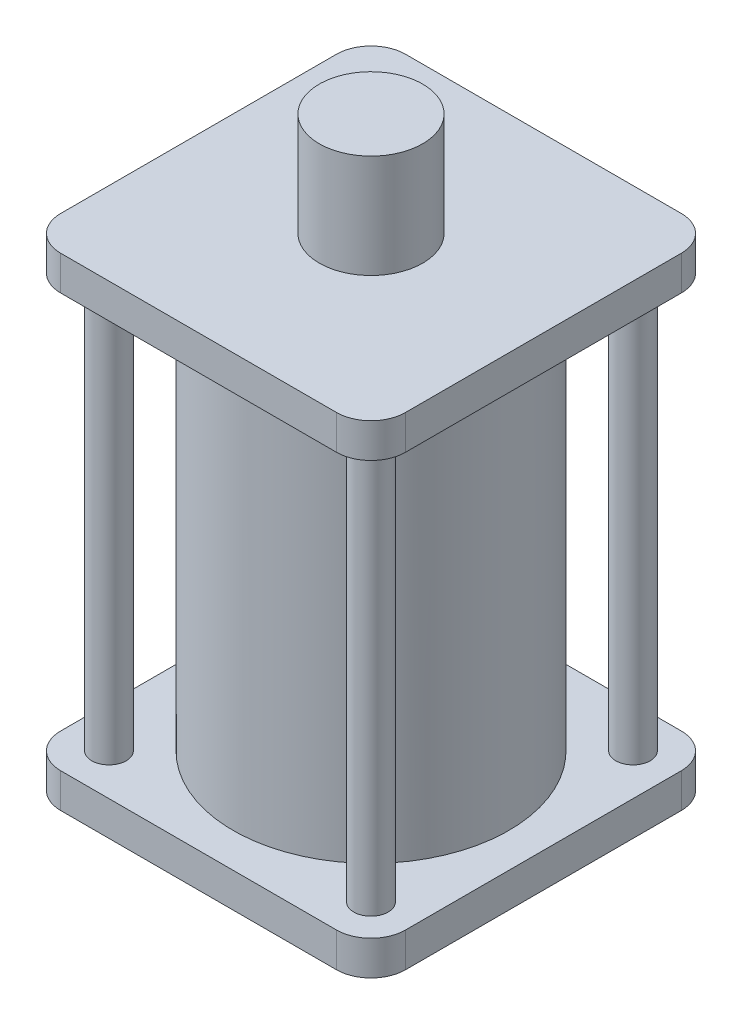
ISO-10303-21;
HEADER;
FILE_DESCRIPTION(('STEP AP214'),'2;1');
FILE_NAME('part.step','',(''),(''),'','','');
FILE_SCHEMA(('AUTOMOTIVE_DESIGN { 1 0 10303 214 1 1 1 1 }'));
ENDSEC;
DATA;
#1=APPLICATION_CONTEXT('core data for automotive mechanical design processes');
#2=APPLICATION_PROTOCOL_DEFINITION('international standard','automotive_design',2000,#1);
#3=PRODUCT_CONTEXT('',#1,'mechanical');
#4=PRODUCT('Part','Part','',(#3));
#5=PRODUCT_RELATED_PRODUCT_CATEGORY('part','',(#4));
#6=PRODUCT_DEFINITION_FORMATION('','',#4);
#7=PRODUCT_DEFINITION_CONTEXT('part definition',#1,'design');
#8=PRODUCT_DEFINITION('design','',#6,#7);
#9=PRODUCT_DEFINITION_SHAPE('','',#8);
#10=(LENGTH_UNIT() NAMED_UNIT(*) SI_UNIT(.MILLI.,.METRE.));
#11=(NAMED_UNIT(*) PLANE_ANGLE_UNIT() SI_UNIT($,.RADIAN.));
#12=(NAMED_UNIT(*) SI_UNIT($,.STERADIAN.) SOLID_ANGLE_UNIT());
#13=UNCERTAINTY_MEASURE_WITH_UNIT(LENGTH_MEASURE(1.E-05),#10,'distance_accuracy_value','');
#14=(GEOMETRIC_REPRESENTATION_CONTEXT(3) GLOBAL_UNCERTAINTY_ASSIGNED_CONTEXT((#13)) GLOBAL_UNIT_ASSIGNED_CONTEXT((#10,
#11,#12)) REPRESENTATION_CONTEXT('',''));
#15=CARTESIAN_POINT('',(0.,0.,0.));
#16=DIRECTION('',(0.,0.,1.));
#17=DIRECTION('',(1.,0.,0.));
#18=AXIS2_PLACEMENT_3D('',#15,#16,#17);
#19=CARTESIAN_POINT('',(0.,170.,0.));
#20=DIRECTION('',(0.,-1.,0.));
#21=DIRECTION('',(0.,0.,-1.));
#22=AXIS2_PLACEMENT_3D('',#19,#20,#21);
#23=CYLINDRICAL_SURFACE('',#22,15.);
#24=CARTESIAN_POINT('',(0.,170.,0.));
#25=DIRECTION('',(0.,1.,0.));
#26=DIRECTION('',(0.,0.,1.));
#27=AXIS2_PLACEMENT_3D('',#24,#25,#26);
#28=CIRCLE('',#27,15.);
#29=CARTESIAN_POINT('',(0.,170.,15.));
#30=VERTEX_POINT('',#29);
#31=EDGE_CURVE('E11',#30,#30,#28,.T.);
#32=ORIENTED_EDGE('',*,*,#31,.F.);
#33=EDGE_LOOP('',(#32));
#34=FACE_BOUND('',#33,.T.);
#35=CARTESIAN_POINT('',(0.,140.,0.));
#36=DIRECTION('',(0.,1.,0.));
#37=DIRECTION('',(0.,0.,1.));
#38=AXIS2_PLACEMENT_3D('',#35,#36,#37);
#39=CIRCLE('',#38,15.);
#40=CARTESIAN_POINT('',(0.,140.,15.));
#41=VERTEX_POINT('',#40);
#42=EDGE_CURVE('E45',#41,#41,#39,.T.);
#43=ORIENTED_EDGE('',*,*,#42,.T.);
#44=EDGE_LOOP('',(#43));
#45=FACE_BOUND('',#44,.T.);
#46=ADVANCED_FACE('F42',(#34,#45),#23,.T.);
#47=CARTESIAN_POINT('',(0.,170.,0.));
#48=DIRECTION('',(0.,1.,0.));
#49=DIRECTION('',(0.,0.,1.));
#50=AXIS2_PLACEMENT_3D('',#47,#48,#49);
#51=PLANE('',#50);
#52=ORIENTED_EDGE('',*,*,#31,.T.);
#53=EDGE_LOOP('',(#52));
#54=FACE_BOUND('',#53,.T.);
#55=ADVANCED_FACE('F57',(#54),#51,.T.);
#56=CARTESIAN_POINT('',(0.,140.,0.));
#57=DIRECTION('',(0.,1.,0.));
#58=DIRECTION('',(0.,0.,1.));
#59=AXIS2_PLACEMENT_3D('',#56,#57,#58);
#60=PLANE('',#59);
#61=ORIENTED_EDGE('',*,*,#42,.F.);
#62=EDGE_LOOP('',(#61));
#63=FACE_BOUND('',#62,.T.);
#64=ADVANCED_FACE('F55',(#63),#60,.F.);
#65=CLOSED_SHELL('',(#46,#55,#64));
#66=MANIFOLD_SOLID_BREP('B2',#65);
#67=CARTESIAN_POINT('',(50.,10.,50.));
#68=DIRECTION('',(-1.,0.,0.));
#69=DIRECTION('',(0.,0.,1.));
#70=AXIS2_PLACEMENT_3D('',#67,#68,#69);
#71=PLANE('',#70);
#72=DIRECTION('',(0.,0.,-1.));
#73=VECTOR('',#72,1.);
#74=CARTESIAN_POINT('',(50.,0.,50.));
#75=LINE('',#74,#73);
#76=CARTESIAN_POINT('',(50.,0.,40.));
#77=VERTEX_POINT('',#76);
#78=CARTESIAN_POINT('',(50.,0.,-40.));
#79=VERTEX_POINT('',#78);
#80=EDGE_CURVE('E223',#77,#79,#75,.T.);
#81=ORIENTED_EDGE('',*,*,#80,.T.);
#82=DIRECTION('',(0.,-1.,0.));
#83=VECTOR('',#82,1.);
#84=CARTESIAN_POINT('',(50.,10.,-40.));
#85=LINE('',#84,#83);
#86=CARTESIAN_POINT('',(50.,10.,-40.));
#87=VERTEX_POINT('',#86);
#88=EDGE_CURVE('E201',#79,#87,#85,.F.);
#89=ORIENTED_EDGE('',*,*,#88,.T.);
#90=DIRECTION('',(0.,0.,-1.));
#91=VECTOR('',#90,1.);
#92=CARTESIAN_POINT('',(50.,10.,50.));
#93=LINE('',#92,#91);
#94=CARTESIAN_POINT('',(50.,10.,40.));
#95=VERTEX_POINT('',#94);
#96=EDGE_CURVE('E234',#95,#87,#93,.T.);
#97=ORIENTED_EDGE('',*,*,#96,.F.);
#98=DIRECTION('',(0.,-1.,0.));
#99=VECTOR('',#98,1.);
#100=CARTESIAN_POINT('',(50.,10.,40.));
#101=LINE('',#100,#99);
#102=EDGE_CURVE('E206',#95,#77,#101,.T.);
#103=ORIENTED_EDGE('',*,*,#102,.T.);
#104=EDGE_LOOP('',(#81,#89,#97,#103));
#105=FACE_BOUND('',#104,.T.);
#106=ADVANCED_FACE('F82',(#105),#71,.F.);
#107=CARTESIAN_POINT('',(-50.,10.,-50.));
#108=DIRECTION('',(0.,0.,1.));
#109=DIRECTION('',(1.,0.,0.));
#110=AXIS2_PLACEMENT_3D('',#107,#108,#109);
#111=PLANE('',#110);
#112=DIRECTION('',(-1.,0.,0.));
#113=VECTOR('',#112,1.);
#114=CARTESIAN_POINT('',(-50.,10.,-50.));
#115=LINE('',#114,#113);
#116=CARTESIAN_POINT('',(40.,10.,-50.));
#117=VERTEX_POINT('',#116);
#118=CARTESIAN_POINT('',(-40.,10.,-50.));
#119=VERTEX_POINT('',#118);
#120=EDGE_CURVE('E216',#117,#119,#115,.T.);
#121=ORIENTED_EDGE('',*,*,#120,.F.);
#122=DIRECTION('',(0.,-1.,0.));
#123=VECTOR('',#122,1.);
#124=CARTESIAN_POINT('',(40.,10.,-50.));
#125=LINE('',#124,#123);
#126=CARTESIAN_POINT('',(40.,0.,-50.));
#127=VERTEX_POINT('',#126);
#128=EDGE_CURVE('E200',#117,#127,#125,.T.);
#129=ORIENTED_EDGE('',*,*,#128,.T.);
#130=DIRECTION('',(-1.,0.,0.));
#131=VECTOR('',#130,1.);
#132=CARTESIAN_POINT('',(-50.,0.,-50.));
#133=LINE('',#132,#131);
#134=CARTESIAN_POINT('',(-40.,0.,-50.));
#135=VERTEX_POINT('',#134);
#136=EDGE_CURVE('E213',#127,#135,#133,.T.);
#137=ORIENTED_EDGE('',*,*,#136,.T.);
#138=DIRECTION('',(0.,-1.,0.));
#139=VECTOR('',#138,1.);
#140=CARTESIAN_POINT('',(-40.,10.,-50.));
#141=LINE('',#140,#139);
#142=EDGE_CURVE('E218',#135,#119,#141,.F.);
#143=ORIENTED_EDGE('',*,*,#142,.T.);
#144=EDGE_LOOP('',(#121,#129,#137,#143));
#145=FACE_BOUND('',#144,.T.);
#146=ADVANCED_FACE('F212',(#145),#111,.F.);
#147=CARTESIAN_POINT('',(-50.,10.,50.));
#148=DIRECTION('',(1.,0.,0.));
#149=DIRECTION('',(0.,0.,-1.));
#150=AXIS2_PLACEMENT_3D('',#147,#148,#149);
#151=PLANE('',#150);
#152=DIRECTION('',(0.,0.,1.));
#153=VECTOR('',#152,1.);
#154=CARTESIAN_POINT('',(-50.,0.,50.));
#155=LINE('',#154,#153);
#156=CARTESIAN_POINT('',(-50.,0.,-40.));
#157=VERTEX_POINT('',#156);
#158=CARTESIAN_POINT('',(-50.,0.,40.));
#159=VERTEX_POINT('',#158);
#160=EDGE_CURVE('E222',#157,#159,#155,.T.);
#161=ORIENTED_EDGE('',*,*,#160,.T.);
#162=DIRECTION('',(0.,-1.,0.));
#163=VECTOR('',#162,1.);
#164=CARTESIAN_POINT('',(-50.,10.,40.));
#165=LINE('',#164,#163);
#166=CARTESIAN_POINT('',(-50.,10.,40.));
#167=VERTEX_POINT('',#166);
#168=EDGE_CURVE('E284',#159,#167,#165,.F.);
#169=ORIENTED_EDGE('',*,*,#168,.T.);
#170=DIRECTION('',(0.,0.,1.));
#171=VECTOR('',#170,1.);
#172=CARTESIAN_POINT('',(-50.,10.,50.));
#173=LINE('',#172,#171);
#174=CARTESIAN_POINT('',(-50.,10.,-40.));
#175=VERTEX_POINT('',#174);
#176=EDGE_CURVE('E351',#175,#167,#173,.T.);
#177=ORIENTED_EDGE('',*,*,#176,.F.);
#178=DIRECTION('',(0.,-1.,0.));
#179=VECTOR('',#178,1.);
#180=CARTESIAN_POINT('',(-50.,10.,-40.));
#181=LINE('',#180,#179);
#182=EDGE_CURVE('E281',#175,#157,#181,.T.);
#183=ORIENTED_EDGE('',*,*,#182,.T.);
#184=EDGE_LOOP('',(#161,#169,#177,#183));
#185=FACE_BOUND('',#184,.T.);
#186=ADVANCED_FACE('F373',(#185),#151,.F.);
#187=CARTESIAN_POINT('',(-50.,10.,50.));
#188=DIRECTION('',(0.,0.,-1.));
#189=DIRECTION('',(-1.,0.,0.));
#190=AXIS2_PLACEMENT_3D('',#187,#188,#189);
#191=PLANE('',#190);
#192=DIRECTION('',(1.,0.,0.));
#193=VECTOR('',#192,1.);
#194=CARTESIAN_POINT('',(-50.,0.,50.));
#195=LINE('',#194,#193);
#196=CARTESIAN_POINT('',(-40.,0.,50.));
#197=VERTEX_POINT('',#196);
#198=CARTESIAN_POINT('',(40.,0.,50.));
#199=VERTEX_POINT('',#198);
#200=EDGE_CURVE('E226',#197,#199,#195,.T.);
#201=ORIENTED_EDGE('',*,*,#200,.T.);
#202=DIRECTION('',(0.,-1.,0.));
#203=VECTOR('',#202,1.);
#204=CARTESIAN_POINT('',(40.,10.,50.));
#205=LINE('',#204,#203);
#206=CARTESIAN_POINT('',(40.,10.,50.));
#207=VERTEX_POINT('',#206);
#208=EDGE_CURVE('E279',#199,#207,#205,.F.);
#209=ORIENTED_EDGE('',*,*,#208,.T.);
#210=DIRECTION('',(1.,0.,0.));
#211=VECTOR('',#210,1.);
#212=CARTESIAN_POINT('',(-50.,10.,50.));
#213=LINE('',#212,#211);
#214=CARTESIAN_POINT('',(-40.,10.,50.));
#215=VERTEX_POINT('',#214);
#216=EDGE_CURVE('E239',#215,#207,#213,.T.);
#217=ORIENTED_EDGE('',*,*,#216,.F.);
#218=DIRECTION('',(0.,-1.,0.));
#219=VECTOR('',#218,1.);
#220=CARTESIAN_POINT('',(-40.,10.,50.));
#221=LINE('',#220,#219);
#222=EDGE_CURVE('E276',#215,#197,#221,.T.);
#223=ORIENTED_EDGE('',*,*,#222,.T.);
#224=EDGE_LOOP('',(#201,#209,#217,#223));
#225=FACE_BOUND('',#224,.T.);
#226=ADVANCED_FACE('F368',(#225),#191,.F.);
#227=CARTESIAN_POINT('',(0.,10.,0.));
#228=DIRECTION('',(0.,-1.,0.));
#229=DIRECTION('',(0.,0.,-1.));
#230=AXIS2_PLACEMENT_3D('',#227,#228,#229);
#231=PLANE('',#230);
#232=CARTESIAN_POINT('',(-38.,10.,38.));
#233=DIRECTION('',(0.,-1.,0.));
#234=DIRECTION('',(0.,0.,-1.));
#235=AXIS2_PLACEMENT_3D('',#232,#233,#234);
#236=CIRCLE('',#235,5.);
#237=CARTESIAN_POINT('',(-38.,10.,33.));
#238=VERTEX_POINT('',#237);
#239=EDGE_CURVE('E257',#238,#238,#236,.F.);
#240=ORIENTED_EDGE('',*,*,#239,.F.);
#241=EDGE_LOOP('',(#240));
#242=FACE_BOUND('',#241,.T.);
#243=CARTESIAN_POINT('',(38.,10.,38.));
#244=DIRECTION('',(0.,-1.,0.));
#245=DIRECTION('',(0.,0.,-1.));
#246=AXIS2_PLACEMENT_3D('',#243,#244,#245);
#247=CIRCLE('',#246,5.);
#248=CARTESIAN_POINT('',(38.,10.,33.));
#249=VERTEX_POINT('',#248);
#250=EDGE_CURVE('E251',#249,#249,#247,.F.);
#251=ORIENTED_EDGE('',*,*,#250,.F.);
#252=EDGE_LOOP('',(#251));
#253=FACE_BOUND('',#252,.T.);
#254=CARTESIAN_POINT('',(38.,10.,-38.));
#255=DIRECTION('',(0.,-1.,0.));
#256=DIRECTION('',(0.,0.,-1.));
#257=AXIS2_PLACEMENT_3D('',#254,#255,#256);
#258=CIRCLE('',#257,5.);
#259=CARTESIAN_POINT('',(38.,10.,-43.));
#260=VERTEX_POINT('',#259);
#261=EDGE_CURVE('E245',#260,#260,#258,.F.);
#262=ORIENTED_EDGE('',*,*,#261,.F.);
#263=EDGE_LOOP('',(#262));
#264=FACE_BOUND('',#263,.T.);
#265=CARTESIAN_POINT('',(0.,9.99999999999999,0.));
#266=DIRECTION('',(0.,-1.,0.));
#267=DIRECTION('',(0.,0.,-1.));
#268=AXIS2_PLACEMENT_3D('',#265,#266,#267);
#269=CIRCLE('',#268,40.);
#270=CARTESIAN_POINT('',(0.,9.99999999999999,-40.));
#271=VERTEX_POINT('',#270);
#272=EDGE_CURVE('E238',#271,#271,#269,.F.);
#273=ORIENTED_EDGE('',*,*,#272,.F.);
#274=EDGE_LOOP('',(#273));
#275=FACE_BOUND('',#274,.T.);
#276=CARTESIAN_POINT('',(-38.,10.,-38.));
#277=DIRECTION('',(0.,-1.,0.));
#278=DIRECTION('',(0.,0.,-1.));
#279=AXIS2_PLACEMENT_3D('',#276,#277,#278);
#280=CIRCLE('',#279,5.);
#281=CARTESIAN_POINT('',(-38.,10.,-43.));
#282=VERTEX_POINT('',#281);
#283=EDGE_CURVE('E235',#282,#282,#280,.F.);
#284=ORIENTED_EDGE('',*,*,#283,.F.);
#285=EDGE_LOOP('',(#284));
#286=FACE_BOUND('',#285,.T.);
#287=ORIENTED_EDGE('',*,*,#96,.T.);
#288=CARTESIAN_POINT('',(40.,10.,-40.));
#289=DIRECTION('',(0.,-1.,0.));
#290=DIRECTION('',(0.,0.,-1.));
#291=AXIS2_PLACEMENT_3D('',#288,#289,#290);
#292=CIRCLE('',#291,10.);
#293=EDGE_CURVE('E274',#87,#117,#292,.F.);
#294=ORIENTED_EDGE('',*,*,#293,.T.);
#295=ORIENTED_EDGE('',*,*,#120,.T.);
#296=CARTESIAN_POINT('',(-40.,10.,-40.));
#297=DIRECTION('',(0.,-1.,0.));
#298=DIRECTION('',(0.,0.,-1.));
#299=AXIS2_PLACEMENT_3D('',#296,#297,#298);
#300=CIRCLE('',#299,10.);
#301=EDGE_CURVE('E268',#119,#175,#300,.F.);
#302=ORIENTED_EDGE('',*,*,#301,.T.);
#303=ORIENTED_EDGE('',*,*,#176,.T.);
#304=CARTESIAN_POINT('',(-40.,10.,40.));
#305=DIRECTION('',(0.,-1.,0.));
#306=DIRECTION('',(0.,0.,-1.));
#307=AXIS2_PLACEMENT_3D('',#304,#305,#306);
#308=CIRCLE('',#307,10.);
#309=EDGE_CURVE('E270',#167,#215,#308,.F.);
#310=ORIENTED_EDGE('',*,*,#309,.T.);
#311=ORIENTED_EDGE('',*,*,#216,.T.);
#312=CARTESIAN_POINT('',(40.,10.,40.));
#313=DIRECTION('',(0.,-1.,0.));
#314=DIRECTION('',(0.,0.,-1.));
#315=AXIS2_PLACEMENT_3D('',#312,#313,#314);
#316=CIRCLE('',#315,10.);
#317=EDGE_CURVE('E272',#207,#95,#316,.F.);
#318=ORIENTED_EDGE('',*,*,#317,.T.);
#319=EDGE_LOOP('',(#287,#294,#295,#302,#303,#310,#311,#318));
#320=FACE_BOUND('',#319,.T.);
#321=ADVANCED_FACE('F357',(#242,#253,#264,#275,#286,#320),#231,.F.);
#322=CARTESIAN_POINT('',(0.,0.,0.));
#323=DIRECTION('',(0.,-1.,0.));
#324=DIRECTION('',(0.,0.,-1.));
#325=AXIS2_PLACEMENT_3D('',#322,#323,#324);
#326=PLANE('',#325);
#327=ORIENTED_EDGE('',*,*,#136,.F.);
#328=CARTESIAN_POINT('',(40.,0.,-40.));
#329=DIRECTION('',(0.,-1.,0.));
#330=DIRECTION('',(0.,0.,-1.));
#331=AXIS2_PLACEMENT_3D('',#328,#329,#330);
#332=CIRCLE('',#331,10.);
#333=EDGE_CURVE('E196',#127,#79,#332,.T.);
#334=ORIENTED_EDGE('',*,*,#333,.T.);
#335=ORIENTED_EDGE('',*,*,#80,.F.);
#336=CARTESIAN_POINT('',(40.,0.,40.));
#337=DIRECTION('',(0.,-1.,0.));
#338=DIRECTION('',(0.,0.,-1.));
#339=AXIS2_PLACEMENT_3D('',#336,#337,#338);
#340=CIRCLE('',#339,10.);
#341=EDGE_CURVE('E207',#77,#199,#340,.T.);
#342=ORIENTED_EDGE('',*,*,#341,.T.);
#343=ORIENTED_EDGE('',*,*,#200,.F.);
#344=CARTESIAN_POINT('',(-40.,0.,40.));
#345=DIRECTION('',(0.,-1.,0.));
#346=DIRECTION('',(0.,0.,-1.));
#347=AXIS2_PLACEMENT_3D('',#344,#345,#346);
#348=CIRCLE('',#347,10.);
#349=EDGE_CURVE('E262',#197,#159,#348,.T.);
#350=ORIENTED_EDGE('',*,*,#349,.T.);
#351=ORIENTED_EDGE('',*,*,#160,.F.);
#352=CARTESIAN_POINT('',(-40.,0.,-40.));
#353=DIRECTION('',(0.,-1.,0.));
#354=DIRECTION('',(0.,0.,-1.));
#355=AXIS2_PLACEMENT_3D('',#352,#353,#354);
#356=CIRCLE('',#355,10.);
#357=EDGE_CURVE('E217',#157,#135,#356,.T.);
#358=ORIENTED_EDGE('',*,*,#357,.T.);
#359=EDGE_LOOP('',(#327,#334,#335,#342,#343,#350,#351,#358));
#360=FACE_BOUND('',#359,.T.);
#361=ADVANCED_FACE('F220',(#360),#326,.T.);
#362=CARTESIAN_POINT('',(-38.,144.142135623731,-38.));
#363=DIRECTION('',(0.,-1.,0.));
#364=DIRECTION('',(0.,0.,-1.));
#365=AXIS2_PLACEMENT_3D('',#362,#363,#364);
#366=CYLINDRICAL_SURFACE('',#365,5.);
#367=ORIENTED_EDGE('',*,*,#283,.T.);
#368=EDGE_LOOP('',(#367));
#369=FACE_BOUND('',#368,.T.);
#370=CARTESIAN_POINT('',(-38.,130.,-38.));
#371=DIRECTION('',(0.,1.,0.));
#372=DIRECTION('',(0.,0.,1.));
#373=AXIS2_PLACEMENT_3D('',#370,#371,#372);
#374=CIRCLE('',#373,5.);
#375=CARTESIAN_POINT('',(-38.,130.,-33.));
#376=VERTEX_POINT('',#375);
#377=EDGE_CURVE('E228',#376,#376,#374,.T.);
#378=ORIENTED_EDGE('',*,*,#377,.F.);
#379=EDGE_LOOP('',(#378));
#380=FACE_BOUND('',#379,.T.);
#381=ADVANCED_FACE('F487',(#369,#380),#366,.T.);
#382=CARTESIAN_POINT('',(0.,130.,0.));
#383=DIRECTION('',(0.,-1.,0.));
#384=DIRECTION('',(0.,0.,-1.));
#385=AXIS2_PLACEMENT_3D('',#382,#383,#384);
#386=CYLINDRICAL_SURFACE('',#385,40.);
#387=CARTESIAN_POINT('',(0.,130.,0.));
#388=DIRECTION('',(0.,1.,0.));
#389=DIRECTION('',(0.,0.,1.));
#390=AXIS2_PLACEMENT_3D('',#387,#388,#389);
#391=CIRCLE('',#390,40.);
#392=CARTESIAN_POINT('',(0.,130.,40.));
#393=VERTEX_POINT('',#392);
#394=EDGE_CURVE('E342',#393,#393,#391,.T.);
#395=ORIENTED_EDGE('',*,*,#394,.F.);
#396=EDGE_LOOP('',(#395));
#397=FACE_BOUND('',#396,.T.);
#398=ORIENTED_EDGE('',*,*,#272,.T.);
#399=EDGE_LOOP('',(#398));
#400=FACE_BOUND('',#399,.T.);
#401=ADVANCED_FACE('F484',(#397,#400),#386,.T.);
#402=CARTESIAN_POINT('',(-50.,140.,-50.));
#403=DIRECTION('',(1.,0.,0.));
#404=DIRECTION('',(0.,0.,-1.));
#405=AXIS2_PLACEMENT_3D('',#402,#403,#404);
#406=PLANE('',#405);
#407=DIRECTION('',(0.,0.,1.));
#408=VECTOR('',#407,1.);
#409=CARTESIAN_POINT('',(-50.,140.,-50.));
#410=LINE('',#409,#408);
#411=CARTESIAN_POINT('',(-50.,140.,-40.));
#412=VERTEX_POINT('',#411);
#413=CARTESIAN_POINT('',(-50.,140.,40.));
#414=VERTEX_POINT('',#413);
#415=EDGE_CURVE('E341',#412,#414,#410,.T.);
#416=ORIENTED_EDGE('',*,*,#415,.F.);
#417=DIRECTION('',(0.,-1.,0.));
#418=VECTOR('',#417,1.);
#419=CARTESIAN_POINT('',(-50.,140.,-40.));
#420=LINE('',#419,#418);
#421=CARTESIAN_POINT('',(-50.,130.,-40.));
#422=VERTEX_POINT('',#421);
#423=EDGE_CURVE('E288',#412,#422,#420,.T.);
#424=ORIENTED_EDGE('',*,*,#423,.T.);
#425=DIRECTION('',(0.,0.,1.));
#426=VECTOR('',#425,1.);
#427=CARTESIAN_POINT('',(-50.,130.,-50.));
#428=LINE('',#427,#426);
#429=CARTESIAN_POINT('',(-50.,130.,40.));
#430=VERTEX_POINT('',#429);
#431=EDGE_CURVE('E332',#422,#430,#428,.T.);
#432=ORIENTED_EDGE('',*,*,#431,.T.);
#433=DIRECTION('',(0.,-1.,0.));
#434=VECTOR('',#433,1.);
#435=CARTESIAN_POINT('',(-50.,140.,40.));
#436=LINE('',#435,#434);
#437=EDGE_CURVE('E286',#430,#414,#436,.F.);
#438=ORIENTED_EDGE('',*,*,#437,.T.);
#439=EDGE_LOOP('',(#416,#424,#432,#438));
#440=FACE_BOUND('',#439,.T.);
#441=ADVANCED_FACE('F467',(#440),#406,.F.);
#442=CARTESIAN_POINT('',(-50.,140.,50.));
#443=DIRECTION('',(0.,0.,-1.));
#444=DIRECTION('',(-1.,0.,0.));
#445=AXIS2_PLACEMENT_3D('',#442,#443,#444);
#446=PLANE('',#445);
#447=DIRECTION('',(1.,0.,0.));
#448=VECTOR('',#447,1.);
#449=CARTESIAN_POINT('',(-50.,130.,50.));
#450=LINE('',#449,#448);
#451=CARTESIAN_POINT('',(-40.,130.,50.));
#452=VERTEX_POINT('',#451);
#453=CARTESIAN_POINT('',(40.,130.,50.));
#454=VERTEX_POINT('',#453);
#455=EDGE_CURVE('E321',#452,#454,#450,.T.);
#456=ORIENTED_EDGE('',*,*,#455,.T.);
#457=DIRECTION('',(0.,-1.,0.));
#458=VECTOR('',#457,1.);
#459=CARTESIAN_POINT('',(40.,140.,50.));
#460=LINE('',#459,#458);
#461=CARTESIAN_POINT('',(40.,140.,50.));
#462=VERTEX_POINT('',#461);
#463=EDGE_CURVE('E40',#454,#462,#460,.F.);
#464=ORIENTED_EDGE('',*,*,#463,.T.);
#465=DIRECTION('',(1.,0.,0.));
#466=VECTOR('',#465,1.);
#467=CARTESIAN_POINT('',(-50.,140.,50.));
#468=LINE('',#467,#466);
#469=CARTESIAN_POINT('',(-40.,140.,50.));
#470=VERTEX_POINT('',#469);
#471=EDGE_CURVE('E323',#470,#462,#468,.T.);
#472=ORIENTED_EDGE('',*,*,#471,.F.);
#473=DIRECTION('',(0.,-1.,0.));
#474=VECTOR('',#473,1.);
#475=CARTESIAN_POINT('',(-40.,140.,50.));
#476=LINE('',#475,#474);
#477=EDGE_CURVE('E90',#470,#452,#476,.T.);
#478=ORIENTED_EDGE('',*,*,#477,.T.);
#479=EDGE_LOOP('',(#456,#464,#472,#478));
#480=FACE_BOUND('',#479,.T.);
#481=ADVANCED_FACE('F320',(#480),#446,.F.);
#482=CARTESIAN_POINT('',(50.,140.,-50.));
#483=DIRECTION('',(-1.,0.,0.));
#484=DIRECTION('',(0.,0.,1.));
#485=AXIS2_PLACEMENT_3D('',#482,#483,#484);
#486=PLANE('',#485);
#487=DIRECTION('',(0.,0.,-1.));
#488=VECTOR('',#487,1.);
#489=CARTESIAN_POINT('',(50.,130.,-50.));
#490=LINE('',#489,#488);
#491=CARTESIAN_POINT('',(50.,130.,40.));
#492=VERTEX_POINT('',#491);
#493=CARTESIAN_POINT('',(50.,130.,-40.));
#494=VERTEX_POINT('',#493);
#495=EDGE_CURVE('E331',#492,#494,#490,.T.);
#496=ORIENTED_EDGE('',*,*,#495,.T.);
#497=DIRECTION('',(0.,-1.,0.));
#498=VECTOR('',#497,1.);
#499=CARTESIAN_POINT('',(50.,140.,-40.));
#500=LINE('',#499,#498);
#501=CARTESIAN_POINT('',(50.,140.,-40.));
#502=VERTEX_POINT('',#501);
#503=EDGE_CURVE('E97',#494,#502,#500,.F.);
#504=ORIENTED_EDGE('',*,*,#503,.T.);
#505=DIRECTION('',(0.,0.,-1.));
#506=VECTOR('',#505,1.);
#507=CARTESIAN_POINT('',(50.,140.,-50.));
#508=LINE('',#507,#506);
#509=CARTESIAN_POINT('',(50.,140.,40.));
#510=VERTEX_POINT('',#509);
#511=EDGE_CURVE('E459',#510,#502,#508,.T.);
#512=ORIENTED_EDGE('',*,*,#511,.F.);
#513=DIRECTION('',(0.,-1.,0.));
#514=VECTOR('',#513,1.);
#515=CARTESIAN_POINT('',(50.,140.,40.));
#516=LINE('',#515,#514);
#517=EDGE_CURVE('E311',#510,#492,#516,.T.);
#518=ORIENTED_EDGE('',*,*,#517,.T.);
#519=EDGE_LOOP('',(#496,#504,#512,#518));
#520=FACE_BOUND('',#519,.T.);
#521=ADVANCED_FACE('F470',(#520),#486,.F.);
#522=CARTESIAN_POINT('',(-50.,140.,-50.));
#523=DIRECTION('',(0.,0.,1.));
#524=DIRECTION('',(1.,0.,0.));
#525=AXIS2_PLACEMENT_3D('',#522,#523,#524);
#526=PLANE('',#525);
#527=DIRECTION('',(-1.,0.,0.));
#528=VECTOR('',#527,1.);
#529=CARTESIAN_POINT('',(-50.,130.,-50.));
#530=LINE('',#529,#528);
#531=CARTESIAN_POINT('',(40.,130.,-50.));
#532=VERTEX_POINT('',#531);
#533=CARTESIAN_POINT('',(-40.,130.,-50.));
#534=VERTEX_POINT('',#533);
#535=EDGE_CURVE('E334',#532,#534,#530,.T.);
#536=ORIENTED_EDGE('',*,*,#535,.T.);
#537=DIRECTION('',(0.,-1.,0.));
#538=VECTOR('',#537,1.);
#539=CARTESIAN_POINT('',(-40.,140.,-50.));
#540=LINE('',#539,#538);
#541=CARTESIAN_POINT('',(-40.,140.,-50.));
#542=VERTEX_POINT('',#541);
#543=EDGE_CURVE('E302',#534,#542,#540,.F.);
#544=ORIENTED_EDGE('',*,*,#543,.T.);
#545=DIRECTION('',(-1.,0.,0.));
#546=VECTOR('',#545,1.);
#547=CARTESIAN_POINT('',(-50.,140.,-50.));
#548=LINE('',#547,#546);
#549=CARTESIAN_POINT('',(40.,140.,-50.));
#550=VERTEX_POINT('',#549);
#551=EDGE_CURVE('E345',#550,#542,#548,.T.);
#552=ORIENTED_EDGE('',*,*,#551,.F.);
#553=DIRECTION('',(0.,-1.,0.));
#554=VECTOR('',#553,1.);
#555=CARTESIAN_POINT('',(40.,140.,-50.));
#556=LINE('',#555,#554);
#557=EDGE_CURVE('E299',#550,#532,#556,.T.);
#558=ORIENTED_EDGE('',*,*,#557,.T.);
#559=EDGE_LOOP('',(#536,#544,#552,#558));
#560=FACE_BOUND('',#559,.T.);
#561=ADVANCED_FACE('F469',(#560),#526,.F.);
#562=CARTESIAN_POINT('',(0.,140.,0.));
#563=DIRECTION('',(0.,1.,0.));
#564=DIRECTION('',(0.,0.,1.));
#565=AXIS2_PLACEMENT_3D('',#562,#563,#564);
#566=PLANE('',#565);
#567=ORIENTED_EDGE('',*,*,#551,.T.);
#568=CARTESIAN_POINT('',(-40.,140.,-40.));
#569=DIRECTION('',(0.,1.,0.));
#570=DIRECTION('',(0.,0.,1.));
#571=AXIS2_PLACEMENT_3D('',#568,#569,#570);
#572=CIRCLE('',#571,10.);
#573=EDGE_CURVE('E309',#542,#412,#572,.T.);
#574=ORIENTED_EDGE('',*,*,#573,.T.);
#575=ORIENTED_EDGE('',*,*,#415,.T.);
#576=CARTESIAN_POINT('',(-40.,140.,40.));
#577=DIRECTION('',(0.,1.,0.));
#578=DIRECTION('',(0.,0.,1.));
#579=AXIS2_PLACEMENT_3D('',#576,#577,#578);
#580=CIRCLE('',#579,10.);
#581=EDGE_CURVE('E304',#414,#470,#580,.T.);
#582=ORIENTED_EDGE('',*,*,#581,.T.);
#583=ORIENTED_EDGE('',*,*,#471,.T.);
#584=CARTESIAN_POINT('',(40.,140.,40.));
#585=DIRECTION('',(0.,1.,0.));
#586=DIRECTION('',(0.,0.,1.));
#587=AXIS2_PLACEMENT_3D('',#584,#585,#586);
#588=CIRCLE('',#587,10.);
#589=EDGE_CURVE('E104',#462,#510,#588,.T.);
#590=ORIENTED_EDGE('',*,*,#589,.T.);
#591=ORIENTED_EDGE('',*,*,#511,.T.);
#592=CARTESIAN_POINT('',(40.,140.,-40.));
#593=DIRECTION('',(0.,1.,0.));
#594=DIRECTION('',(0.,0.,1.));
#595=AXIS2_PLACEMENT_3D('',#592,#593,#594);
#596=CIRCLE('',#595,10.);
#597=EDGE_CURVE('E307',#502,#550,#596,.T.);
#598=ORIENTED_EDGE('',*,*,#597,.T.);
#599=EDGE_LOOP('',(#567,#574,#575,#582,#583,#590,#591,#598));
#600=FACE_BOUND('',#599,.T.);
#601=ADVANCED_FACE('F453',(#600),#566,.T.);
#602=CARTESIAN_POINT('',(0.,130.,0.));
#603=DIRECTION('',(0.,1.,0.));
#604=DIRECTION('',(0.,0.,1.));
#605=AXIS2_PLACEMENT_3D('',#602,#603,#604);
#606=PLANE('',#605);
#607=CARTESIAN_POINT('',(-38.,130.,38.));
#608=DIRECTION('',(0.,1.,0.));
#609=DIRECTION('',(0.,0.,1.));
#610=AXIS2_PLACEMENT_3D('',#607,#608,#609);
#611=CIRCLE('',#610,5.);
#612=CARTESIAN_POINT('',(-38.,130.,43.));
#613=VERTEX_POINT('',#612);
#614=EDGE_CURVE('E254',#613,#613,#611,.F.);
#615=ORIENTED_EDGE('',*,*,#614,.F.);
#616=EDGE_LOOP('',(#615));
#617=FACE_BOUND('',#616,.T.);
#618=CARTESIAN_POINT('',(38.,130.,38.));
#619=DIRECTION('',(0.,1.,0.));
#620=DIRECTION('',(0.,0.,1.));
#621=AXIS2_PLACEMENT_3D('',#618,#619,#620);
#622=CIRCLE('',#621,5.);
#623=CARTESIAN_POINT('',(38.,130.,43.));
#624=VERTEX_POINT('',#623);
#625=EDGE_CURVE('E248',#624,#624,#622,.F.);
#626=ORIENTED_EDGE('',*,*,#625,.F.);
#627=EDGE_LOOP('',(#626));
#628=FACE_BOUND('',#627,.T.);
#629=CARTESIAN_POINT('',(38.,130.,-38.));
#630=DIRECTION('',(0.,1.,0.));
#631=DIRECTION('',(0.,0.,1.));
#632=AXIS2_PLACEMENT_3D('',#629,#630,#631);
#633=CIRCLE('',#632,5.);
#634=CARTESIAN_POINT('',(38.,130.,-33.));
#635=VERTEX_POINT('',#634);
#636=EDGE_CURVE('E242',#635,#635,#633,.F.);
#637=ORIENTED_EDGE('',*,*,#636,.F.);
#638=EDGE_LOOP('',(#637));
#639=FACE_BOUND('',#638,.T.);
#640=ORIENTED_EDGE('',*,*,#377,.T.);
#641=EDGE_LOOP('',(#640));
#642=FACE_BOUND('',#641,.T.);
#643=ORIENTED_EDGE('',*,*,#394,.T.);
#644=EDGE_LOOP('',(#643));
#645=FACE_BOUND('',#644,.T.);
#646=ORIENTED_EDGE('',*,*,#431,.F.);
#647=CARTESIAN_POINT('',(-40.,130.,-40.));
#648=DIRECTION('',(0.,1.,0.));
#649=DIRECTION('',(0.,0.,1.));
#650=AXIS2_PLACEMENT_3D('',#647,#648,#649);
#651=CIRCLE('',#650,10.);
#652=EDGE_CURVE('E297',#422,#534,#651,.F.);
#653=ORIENTED_EDGE('',*,*,#652,.T.);
#654=ORIENTED_EDGE('',*,*,#535,.F.);
#655=CARTESIAN_POINT('',(40.,130.,-40.));
#656=DIRECTION('',(0.,1.,0.));
#657=DIRECTION('',(0.,0.,1.));
#658=AXIS2_PLACEMENT_3D('',#655,#656,#657);
#659=CIRCLE('',#658,10.);
#660=EDGE_CURVE('E295',#532,#494,#659,.F.);
#661=ORIENTED_EDGE('',*,*,#660,.T.);
#662=ORIENTED_EDGE('',*,*,#495,.F.);
#663=CARTESIAN_POINT('',(40.,130.,40.));
#664=DIRECTION('',(0.,1.,0.));
#665=DIRECTION('',(0.,0.,1.));
#666=AXIS2_PLACEMENT_3D('',#663,#664,#665);
#667=CIRCLE('',#666,10.);
#668=EDGE_CURVE('E293',#492,#454,#667,.F.);
#669=ORIENTED_EDGE('',*,*,#668,.T.);
#670=ORIENTED_EDGE('',*,*,#455,.F.);
#671=CARTESIAN_POINT('',(-40.,130.,40.));
#672=DIRECTION('',(0.,1.,0.));
#673=DIRECTION('',(0.,0.,1.));
#674=AXIS2_PLACEMENT_3D('',#671,#672,#673);
#675=CIRCLE('',#674,10.);
#676=EDGE_CURVE('E291',#452,#430,#675,.F.);
#677=ORIENTED_EDGE('',*,*,#676,.T.);
#678=EDGE_LOOP('',(#646,#653,#654,#661,#662,#669,#670,#677));
#679=FACE_BOUND('',#678,.T.);
#680=ADVANCED_FACE('F328',(#617,#628,#639,#642,#645,#679),#606,.F.);
#681=CARTESIAN_POINT('',(38.,144.142135623731,-38.));
#682=DIRECTION('',(0.,-1.,0.));
#683=DIRECTION('',(0.,0.,-1.));
#684=AXIS2_PLACEMENT_3D('',#681,#682,#683);
#685=CYLINDRICAL_SURFACE('',#684,5.);
#686=ORIENTED_EDGE('',*,*,#261,.T.);
#687=EDGE_LOOP('',(#686));
#688=FACE_BOUND('',#687,.T.);
#689=ORIENTED_EDGE('',*,*,#636,.T.);
#690=EDGE_LOOP('',(#689));
#691=FACE_BOUND('',#690,.T.);
#692=ADVANCED_FACE('F558',(#688,#691),#685,.T.);
#693=CARTESIAN_POINT('',(38.,144.142135623731,38.));
#694=DIRECTION('',(0.,-1.,0.));
#695=DIRECTION('',(0.,0.,-1.));
#696=AXIS2_PLACEMENT_3D('',#693,#694,#695);
#697=CYLINDRICAL_SURFACE('',#696,5.);
#698=ORIENTED_EDGE('',*,*,#250,.T.);
#699=EDGE_LOOP('',(#698));
#700=FACE_BOUND('',#699,.T.);
#701=ORIENTED_EDGE('',*,*,#625,.T.);
#702=EDGE_LOOP('',(#701));
#703=FACE_BOUND('',#702,.T.);
#704=ADVANCED_FACE('F575',(#700,#703),#697,.T.);
#705=CARTESIAN_POINT('',(-38.,144.142135623731,38.));
#706=DIRECTION('',(0.,-1.,0.));
#707=DIRECTION('',(0.,0.,-1.));
#708=AXIS2_PLACEMENT_3D('',#705,#706,#707);
#709=CYLINDRICAL_SURFACE('',#708,5.);
#710=ORIENTED_EDGE('',*,*,#239,.T.);
#711=EDGE_LOOP('',(#710));
#712=FACE_BOUND('',#711,.T.);
#713=ORIENTED_EDGE('',*,*,#614,.T.);
#714=EDGE_LOOP('',(#713));
#715=FACE_BOUND('',#714,.T.);
#716=ADVANCED_FACE('F400',(#712,#715),#709,.T.);
#717=CARTESIAN_POINT('',(40.,10.,-40.));
#718=DIRECTION('',(0.,-1.,0.));
#719=DIRECTION('',(0.,0.,-1.));
#720=AXIS2_PLACEMENT_3D('',#717,#718,#719);
#721=CYLINDRICAL_SURFACE('',#720,10.);
#722=ORIENTED_EDGE('',*,*,#293,.F.);
#723=ORIENTED_EDGE('',*,*,#88,.F.);
#724=ORIENTED_EDGE('',*,*,#333,.F.);
#725=ORIENTED_EDGE('',*,*,#128,.F.);
#726=EDGE_LOOP('',(#722,#723,#724,#725));
#727=FACE_BOUND('',#726,.T.);
#728=ADVANCED_FACE('F199',(#727),#721,.T.);
#729=CARTESIAN_POINT('',(40.,10.,40.));
#730=DIRECTION('',(0.,-1.,0.));
#731=DIRECTION('',(0.,0.,-1.));
#732=AXIS2_PLACEMENT_3D('',#729,#730,#731);
#733=CYLINDRICAL_SURFACE('',#732,10.);
#734=ORIENTED_EDGE('',*,*,#317,.F.);
#735=ORIENTED_EDGE('',*,*,#208,.F.);
#736=ORIENTED_EDGE('',*,*,#341,.F.);
#737=ORIENTED_EDGE('',*,*,#102,.F.);
#738=EDGE_LOOP('',(#734,#735,#736,#737));
#739=FACE_BOUND('',#738,.T.);
#740=ADVANCED_FACE('F365',(#739),#733,.T.);
#741=CARTESIAN_POINT('',(-40.,10.,40.));
#742=DIRECTION('',(0.,-1.,0.));
#743=DIRECTION('',(0.,0.,-1.));
#744=AXIS2_PLACEMENT_3D('',#741,#742,#743);
#745=CYLINDRICAL_SURFACE('',#744,10.);
#746=ORIENTED_EDGE('',*,*,#309,.F.);
#747=ORIENTED_EDGE('',*,*,#168,.F.);
#748=ORIENTED_EDGE('',*,*,#349,.F.);
#749=ORIENTED_EDGE('',*,*,#222,.F.);
#750=EDGE_LOOP('',(#746,#747,#748,#749));
#751=FACE_BOUND('',#750,.T.);
#752=ADVANCED_FACE('F370',(#751),#745,.T.);
#753=CARTESIAN_POINT('',(-40.,10.,-40.));
#754=DIRECTION('',(0.,-1.,0.));
#755=DIRECTION('',(0.,0.,-1.));
#756=AXIS2_PLACEMENT_3D('',#753,#754,#755);
#757=CYLINDRICAL_SURFACE('',#756,10.);
#758=ORIENTED_EDGE('',*,*,#301,.F.);
#759=ORIENTED_EDGE('',*,*,#142,.F.);
#760=ORIENTED_EDGE('',*,*,#357,.F.);
#761=ORIENTED_EDGE('',*,*,#182,.F.);
#762=EDGE_LOOP('',(#758,#759,#760,#761));
#763=FACE_BOUND('',#762,.T.);
#764=ADVANCED_FACE('F378',(#763),#757,.T.);
#765=CARTESIAN_POINT('',(-40.,140.,-40.));
#766=DIRECTION('',(0.,-1.,0.));
#767=DIRECTION('',(0.,0.,-1.));
#768=AXIS2_PLACEMENT_3D('',#765,#766,#767);
#769=CYLINDRICAL_SURFACE('',#768,10.);
#770=ORIENTED_EDGE('',*,*,#573,.F.);
#771=ORIENTED_EDGE('',*,*,#543,.F.);
#772=ORIENTED_EDGE('',*,*,#652,.F.);
#773=ORIENTED_EDGE('',*,*,#423,.F.);
#774=EDGE_LOOP('',(#770,#771,#772,#773));
#775=FACE_BOUND('',#774,.T.);
#776=ADVANCED_FACE('F380',(#775),#769,.T.);
#777=CARTESIAN_POINT('',(40.,140.,-40.));
#778=DIRECTION('',(0.,-1.,0.));
#779=DIRECTION('',(0.,0.,-1.));
#780=AXIS2_PLACEMENT_3D('',#777,#778,#779);
#781=CYLINDRICAL_SURFACE('',#780,10.);
#782=ORIENTED_EDGE('',*,*,#597,.F.);
#783=ORIENTED_EDGE('',*,*,#503,.F.);
#784=ORIENTED_EDGE('',*,*,#660,.F.);
#785=ORIENTED_EDGE('',*,*,#557,.F.);
#786=EDGE_LOOP('',(#782,#783,#784,#785));
#787=FACE_BOUND('',#786,.T.);
#788=ADVANCED_FACE('F386',(#787),#781,.T.);
#789=CARTESIAN_POINT('',(40.,140.,40.));
#790=DIRECTION('',(0.,-1.,0.));
#791=DIRECTION('',(0.,0.,-1.));
#792=AXIS2_PLACEMENT_3D('',#789,#790,#791);
#793=CYLINDRICAL_SURFACE('',#792,10.);
#794=ORIENTED_EDGE('',*,*,#589,.F.);
#795=ORIENTED_EDGE('',*,*,#463,.F.);
#796=ORIENTED_EDGE('',*,*,#668,.F.);
#797=ORIENTED_EDGE('',*,*,#517,.F.);
#798=EDGE_LOOP('',(#794,#795,#796,#797));
#799=FACE_BOUND('',#798,.T.);
#800=ADVANCED_FACE('F430',(#799),#793,.T.);
#801=CARTESIAN_POINT('',(-40.,140.,40.));
#802=DIRECTION('',(0.,-1.,0.));
#803=DIRECTION('',(0.,0.,-1.));
#804=AXIS2_PLACEMENT_3D('',#801,#802,#803);
#805=CYLINDRICAL_SURFACE('',#804,10.);
#806=ORIENTED_EDGE('',*,*,#581,.F.);
#807=ORIENTED_EDGE('',*,*,#437,.F.);
#808=ORIENTED_EDGE('',*,*,#676,.F.);
#809=ORIENTED_EDGE('',*,*,#477,.F.);
#810=EDGE_LOOP('',(#806,#807,#808,#809));
#811=FACE_BOUND('',#810,.T.);
#812=ADVANCED_FACE('F84',(#811),#805,.T.);
#813=CLOSED_SHELL('',(#106,#146,#186,#226,#321,#361,#381,#401,#441,#481,#521,#561,#601,#680,
#692,#704,#716,#728,#740,#752,#764,#776,#788,#800,#812));
#814=MANIFOLD_SOLID_BREP('B6',#813);
#815=ADVANCED_BREP_SHAPE_REPRESENTATION('',(#18,#66,#814),#14);
#816=SHAPE_DEFINITION_REPRESENTATION(#9,#815);
ENDSEC;
END-ISO-10303-21;
